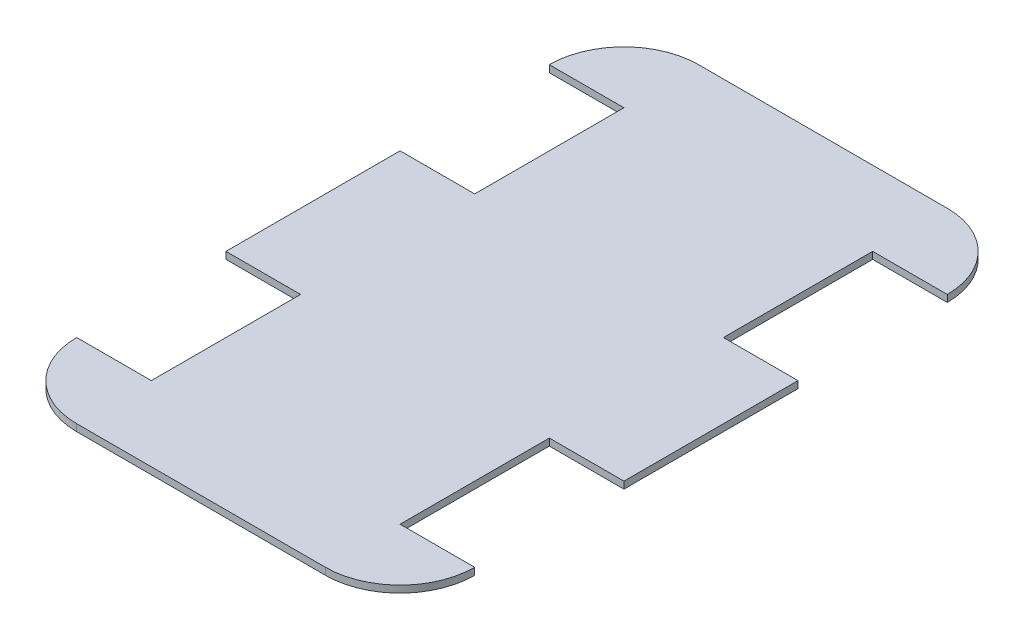
ISO-10303-21;
HEADER;
FILE_DESCRIPTION(('STEP AP214'),'2;1');
FILE_NAME('part.step','',(''),(''),'','','');
FILE_SCHEMA(('AUTOMOTIVE_DESIGN { 1 0 10303 214 1 1 1 1 }'));
ENDSEC;
DATA;
#1=APPLICATION_CONTEXT('core data for automotive mechanical design processes');
#2=APPLICATION_PROTOCOL_DEFINITION('international standard','automotive_design',2000,#1);
#3=PRODUCT_CONTEXT('',#1,'mechanical');
#4=PRODUCT('Part','Part','',(#3));
#5=PRODUCT_RELATED_PRODUCT_CATEGORY('part','',(#4));
#6=PRODUCT_DEFINITION_FORMATION('','',#4);
#7=PRODUCT_DEFINITION_CONTEXT('part definition',#1,'design');
#8=PRODUCT_DEFINITION('design','',#6,#7);
#9=PRODUCT_DEFINITION_SHAPE('','',#8);
#10=(LENGTH_UNIT() NAMED_UNIT(*) SI_UNIT(.MILLI.,.METRE.));
#11=(NAMED_UNIT(*) PLANE_ANGLE_UNIT() SI_UNIT($,.RADIAN.));
#12=(NAMED_UNIT(*) SI_UNIT($,.STERADIAN.) SOLID_ANGLE_UNIT());
#13=UNCERTAINTY_MEASURE_WITH_UNIT(LENGTH_MEASURE(1.E-05),#10,'distance_accuracy_value','');
#14=(GEOMETRIC_REPRESENTATION_CONTEXT(3) GLOBAL_UNCERTAINTY_ASSIGNED_CONTEXT((#13)) GLOBAL_UNIT_ASSIGNED_CONTEXT((#10,
#11,#12)) REPRESENTATION_CONTEXT('',''));
#15=CARTESIAN_POINT('',(0.,0.,0.));
#16=DIRECTION('',(0.,0.,1.));
#17=DIRECTION('',(1.,0.,0.));
#18=AXIS2_PLACEMENT_3D('',#15,#16,#17);
#19=CARTESIAN_POINT('',(130.,2.8,-220.));
#20=DIRECTION('',(-1.,0.,0.));
#21=DIRECTION('',(0.,0.,1.));
#22=AXIS2_PLACEMENT_3D('',#19,#20,#21);
#23=PLANE('',#22);
#24=DIRECTION('',(0.,0.,-1.));
#25=VECTOR('',#24,1.);
#26=CARTESIAN_POINT('',(130.,0.,-220.));
#27=LINE('',#26,#25);
#28=CARTESIAN_POINT('',(130.,0.,-160.));
#29=VERTEX_POINT('',#28);
#30=CARTESIAN_POINT('',(130.,0.,-220.));
#31=VERTEX_POINT('',#30);
#32=EDGE_CURVE('E201',#29,#31,#27,.T.);
#33=ORIENTED_EDGE('',*,*,#32,.T.);
#34=DIRECTION('',(0.,-1.,0.));
#35=VECTOR('',#34,1.);
#36=CARTESIAN_POINT('',(130.,2.8,-220.));
#37=LINE('',#36,#35);
#38=CARTESIAN_POINT('',(130.,2.8,-220.));
#39=VERTEX_POINT('',#38);
#40=EDGE_CURVE('E11',#39,#31,#37,.T.);
#41=ORIENTED_EDGE('',*,*,#40,.F.);
#42=DIRECTION('',(0.,0.,-1.));
#43=VECTOR('',#42,1.);
#44=CARTESIAN_POINT('',(130.,2.8,-220.));
#45=LINE('',#44,#43);
#46=CARTESIAN_POINT('',(130.,2.8,-160.));
#47=VERTEX_POINT('',#46);
#48=EDGE_CURVE('E239',#47,#39,#45,.T.);
#49=ORIENTED_EDGE('',*,*,#48,.F.);
#50=DIRECTION('',(0.,-1.,0.));
#51=VECTOR('',#50,1.);
#52=CARTESIAN_POINT('',(130.,2.8,-160.));
#53=LINE('',#52,#51);
#54=EDGE_CURVE('E197',#47,#29,#53,.T.);
#55=ORIENTED_EDGE('',*,*,#54,.T.);
#56=EDGE_LOOP('',(#33,#41,#49,#55));
#57=FACE_BOUND('',#56,.T.);
#58=ADVANCED_FACE('F33',(#57),#23,.F.);
#59=CARTESIAN_POINT('',(160.,2.8,-220.));
#60=DIRECTION('',(0.,0.,-1.));
#61=DIRECTION('',(-1.,0.,0.));
#62=AXIS2_PLACEMENT_3D('',#59,#60,#61);
#63=PLANE('',#62);
#64=DIRECTION('',(1.,0.,0.));
#65=VECTOR('',#64,1.);
#66=CARTESIAN_POINT('',(160.,0.,-220.));
#67=LINE('',#66,#65);
#68=CARTESIAN_POINT('',(160.,0.,-220.));
#69=VERTEX_POINT('',#68);
#70=EDGE_CURVE('E204',#31,#69,#67,.T.);
#71=ORIENTED_EDGE('',*,*,#70,.T.);
#72=DIRECTION('',(0.,-1.,0.));
#73=VECTOR('',#72,1.);
#74=CARTESIAN_POINT('',(160.,2.8,-220.));
#75=LINE('',#74,#73);
#76=CARTESIAN_POINT('',(160.,2.8,-220.));
#77=VERTEX_POINT('',#76);
#78=EDGE_CURVE('E41',#77,#69,#75,.T.);
#79=ORIENTED_EDGE('',*,*,#78,.F.);
#80=DIRECTION('',(1.,0.,0.));
#81=VECTOR('',#80,1.);
#82=CARTESIAN_POINT('',(160.,2.8,-220.));
#83=LINE('',#82,#81);
#84=EDGE_CURVE('E128',#39,#77,#83,.T.);
#85=ORIENTED_EDGE('',*,*,#84,.F.);
#86=ORIENTED_EDGE('',*,*,#40,.T.);
#87=EDGE_LOOP('',(#71,#79,#85,#86));
#88=FACE_BOUND('',#87,.T.);
#89=ADVANCED_FACE('F357',(#88),#63,.F.);
#90=CARTESIAN_POINT('',(130.,2.8,-220.));
#91=DIRECTION('',(0.,-1.,0.));
#92=DIRECTION('',(0.,0.,-1.));
#93=AXIS2_PLACEMENT_3D('',#90,#91,#92);
#94=CYLINDRICAL_SURFACE('',#93,30.);
#95=CARTESIAN_POINT('',(130.,0.,-220.));
#96=DIRECTION('',(0.,1.,0.));
#97=DIRECTION('',(0.,0.,1.));
#98=AXIS2_PLACEMENT_3D('',#95,#96,#97);
#99=CIRCLE('',#98,30.);
#100=CARTESIAN_POINT('',(130.,0.,-250.));
#101=VERTEX_POINT('',#100);
#102=EDGE_CURVE('E206',#69,#101,#99,.T.);
#103=ORIENTED_EDGE('',*,*,#102,.T.);
#104=DIRECTION('',(0.,-1.,0.));
#105=VECTOR('',#104,1.);
#106=CARTESIAN_POINT('',(130.,2.8,-250.));
#107=LINE('',#106,#105);
#108=CARTESIAN_POINT('',(130.,2.8,-250.));
#109=VERTEX_POINT('',#108);
#110=EDGE_CURVE('E282',#109,#101,#107,.T.);
#111=ORIENTED_EDGE('',*,*,#110,.F.);
#112=CARTESIAN_POINT('',(130.,2.8,-220.));
#113=DIRECTION('',(0.,1.,0.));
#114=DIRECTION('',(0.,0.,1.));
#115=AXIS2_PLACEMENT_3D('',#112,#113,#114);
#116=CIRCLE('',#115,30.);
#117=EDGE_CURVE('E290',#77,#109,#116,.T.);
#118=ORIENTED_EDGE('',*,*,#117,.F.);
#119=ORIENTED_EDGE('',*,*,#78,.T.);
#120=EDGE_LOOP('',(#103,#111,#118,#119));
#121=FACE_BOUND('',#120,.T.);
#122=ADVANCED_FACE('F288',(#121),#94,.T.);
#123=CARTESIAN_POINT('',(30.0000000000002,2.8,-250.));
#124=DIRECTION('',(0.,0.,1.));
#125=DIRECTION('',(1.,0.,0.));
#126=AXIS2_PLACEMENT_3D('',#123,#124,#125);
#127=PLANE('',#126);
#128=DIRECTION('',(-1.,0.,0.));
#129=VECTOR('',#128,1.);
#130=CARTESIAN_POINT('',(30.0000000000002,0.,-250.));
#131=LINE('',#130,#129);
#132=CARTESIAN_POINT('',(30.0000000000002,0.,-250.));
#133=VERTEX_POINT('',#132);
#134=EDGE_CURVE('E208',#101,#133,#131,.T.);
#135=ORIENTED_EDGE('',*,*,#134,.T.);
#136=DIRECTION('',(0.,-1.,0.));
#137=VECTOR('',#136,1.);
#138=CARTESIAN_POINT('',(30.0000000000002,2.8,-250.));
#139=LINE('',#138,#137);
#140=CARTESIAN_POINT('',(30.0000000000002,2.8,-250.));
#141=VERTEX_POINT('',#140);
#142=EDGE_CURVE('E279',#141,#133,#139,.T.);
#143=ORIENTED_EDGE('',*,*,#142,.F.);
#144=DIRECTION('',(-1.,0.,0.));
#145=VECTOR('',#144,1.);
#146=CARTESIAN_POINT('',(30.0000000000002,2.8,-250.));
#147=LINE('',#146,#145);
#148=EDGE_CURVE('E308',#109,#141,#147,.T.);
#149=ORIENTED_EDGE('',*,*,#148,.F.);
#150=ORIENTED_EDGE('',*,*,#110,.T.);
#151=EDGE_LOOP('',(#135,#143,#149,#150));
#152=FACE_BOUND('',#151,.T.);
#153=ADVANCED_FACE('F299',(#152),#127,.F.);
#154=CARTESIAN_POINT('',(29.9999999999999,2.8,-220.));
#155=DIRECTION('',(0.,-1.,0.));
#156=DIRECTION('',(0.,0.,-1.));
#157=AXIS2_PLACEMENT_3D('',#154,#155,#156);
#158=CYLINDRICAL_SURFACE('',#157,30.);
#159=CARTESIAN_POINT('',(29.9999999999999,0.,-220.));
#160=DIRECTION('',(0.,1.,0.));
#161=DIRECTION('',(0.,0.,-1.));
#162=AXIS2_PLACEMENT_3D('',#159,#160,#161);
#163=CIRCLE('',#162,30.);
#164=CARTESIAN_POINT('',(0.,0.,-220.));
#165=VERTEX_POINT('',#164);
#166=EDGE_CURVE('E210',#133,#165,#163,.T.);
#167=ORIENTED_EDGE('',*,*,#166,.T.);
#168=DIRECTION('',(0.,-1.,0.));
#169=VECTOR('',#168,1.);
#170=CARTESIAN_POINT('',(0.,2.8,-220.));
#171=LINE('',#170,#169);
#172=CARTESIAN_POINT('',(0.,2.8,-220.));
#173=VERTEX_POINT('',#172);
#174=EDGE_CURVE('E276',#173,#165,#171,.T.);
#175=ORIENTED_EDGE('',*,*,#174,.F.);
#176=CARTESIAN_POINT('',(29.9999999999999,2.8,-220.));
#177=DIRECTION('',(0.,1.,0.));
#178=DIRECTION('',(0.,0.,-1.));
#179=AXIS2_PLACEMENT_3D('',#176,#177,#178);
#180=CIRCLE('',#179,30.);
#181=EDGE_CURVE('E305',#141,#173,#180,.T.);
#182=ORIENTED_EDGE('',*,*,#181,.F.);
#183=ORIENTED_EDGE('',*,*,#142,.T.);
#184=EDGE_LOOP('',(#167,#175,#182,#183));
#185=FACE_BOUND('',#184,.T.);
#186=ADVANCED_FACE('F303',(#185),#158,.T.);
#187=CARTESIAN_POINT('',(0.,2.8,-220.));
#188=DIRECTION('',(0.,0.,-1.));
#189=DIRECTION('',(-1.,0.,0.));
#190=AXIS2_PLACEMENT_3D('',#187,#188,#189);
#191=PLANE('',#190);
#192=DIRECTION('',(1.,0.,0.));
#193=VECTOR('',#192,1.);
#194=CARTESIAN_POINT('',(0.,0.,-220.));
#195=LINE('',#194,#193);
#196=CARTESIAN_POINT('',(30.,0.,-220.));
#197=VERTEX_POINT('',#196);
#198=EDGE_CURVE('E212',#165,#197,#195,.T.);
#199=ORIENTED_EDGE('',*,*,#198,.T.);
#200=DIRECTION('',(0.,-1.,0.));
#201=VECTOR('',#200,1.);
#202=CARTESIAN_POINT('',(30.,2.8,-220.));
#203=LINE('',#202,#201);
#204=CARTESIAN_POINT('',(30.,2.8,-220.));
#205=VERTEX_POINT('',#204);
#206=EDGE_CURVE('E273',#205,#197,#203,.T.);
#207=ORIENTED_EDGE('',*,*,#206,.F.);
#208=DIRECTION('',(1.,0.,0.));
#209=VECTOR('',#208,1.);
#210=CARTESIAN_POINT('',(0.,2.8,-220.));
#211=LINE('',#210,#209);
#212=EDGE_CURVE('E307',#173,#205,#211,.T.);
#213=ORIENTED_EDGE('',*,*,#212,.F.);
#214=ORIENTED_EDGE('',*,*,#174,.T.);
#215=EDGE_LOOP('',(#199,#207,#213,#214));
#216=FACE_BOUND('',#215,.T.);
#217=ADVANCED_FACE('F370',(#216),#191,.F.);
#218=CARTESIAN_POINT('',(30.,2.8,-220.));
#219=DIRECTION('',(1.,0.,0.));
#220=DIRECTION('',(0.,0.,-1.));
#221=AXIS2_PLACEMENT_3D('',#218,#219,#220);
#222=PLANE('',#221);
#223=DIRECTION('',(0.,0.,1.));
#224=VECTOR('',#223,1.);
#225=CARTESIAN_POINT('',(30.,0.,-220.));
#226=LINE('',#225,#224);
#227=CARTESIAN_POINT('',(30.,0.,-160.));
#228=VERTEX_POINT('',#227);
#229=EDGE_CURVE('E214',#197,#228,#226,.T.);
#230=ORIENTED_EDGE('',*,*,#229,.T.);
#231=DIRECTION('',(0.,-1.,0.));
#232=VECTOR('',#231,1.);
#233=CARTESIAN_POINT('',(30.,2.8,-160.));
#234=LINE('',#233,#232);
#235=CARTESIAN_POINT('',(30.,2.8,-160.));
#236=VERTEX_POINT('',#235);
#237=EDGE_CURVE('E270',#236,#228,#234,.T.);
#238=ORIENTED_EDGE('',*,*,#237,.F.);
#239=DIRECTION('',(0.,0.,1.));
#240=VECTOR('',#239,1.);
#241=CARTESIAN_POINT('',(30.,2.8,-220.));
#242=LINE('',#241,#240);
#243=EDGE_CURVE('E310',#205,#236,#242,.T.);
#244=ORIENTED_EDGE('',*,*,#243,.F.);
#245=ORIENTED_EDGE('',*,*,#206,.T.);
#246=EDGE_LOOP('',(#230,#238,#244,#245));
#247=FACE_BOUND('',#246,.T.);
#248=ADVANCED_FACE('F373',(#247),#222,.F.);
#249=CARTESIAN_POINT('',(30.,2.8,-160.));
#250=DIRECTION('',(0.,0.,1.));
#251=DIRECTION('',(1.,0.,0.));
#252=AXIS2_PLACEMENT_3D('',#249,#250,#251);
#253=PLANE('',#252);
#254=DIRECTION('',(-1.,0.,0.));
#255=VECTOR('',#254,1.);
#256=CARTESIAN_POINT('',(30.,0.,-160.));
#257=LINE('',#256,#255);
#258=CARTESIAN_POINT('',(0.,0.,-160.));
#259=VERTEX_POINT('',#258);
#260=EDGE_CURVE('E216',#228,#259,#257,.T.);
#261=ORIENTED_EDGE('',*,*,#260,.T.);
#262=DIRECTION('',(0.,-1.,0.));
#263=VECTOR('',#262,1.);
#264=CARTESIAN_POINT('',(0.,2.8,-160.));
#265=LINE('',#264,#263);
#266=CARTESIAN_POINT('',(0.,2.8,-160.));
#267=VERTEX_POINT('',#266);
#268=EDGE_CURVE('E267',#267,#259,#265,.T.);
#269=ORIENTED_EDGE('',*,*,#268,.F.);
#270=DIRECTION('',(-1.,0.,0.));
#271=VECTOR('',#270,1.);
#272=CARTESIAN_POINT('',(30.,2.8,-160.));
#273=LINE('',#272,#271);
#274=EDGE_CURVE('E316',#236,#267,#273,.T.);
#275=ORIENTED_EDGE('',*,*,#274,.F.);
#276=ORIENTED_EDGE('',*,*,#237,.T.);
#277=EDGE_LOOP('',(#261,#269,#275,#276));
#278=FACE_BOUND('',#277,.T.);
#279=ADVANCED_FACE('F377',(#278),#253,.F.);
#280=CARTESIAN_POINT('',(0.,2.8,-90.0000000000002));
#281=DIRECTION('',(1.,0.,0.));
#282=DIRECTION('',(0.,0.,-1.));
#283=AXIS2_PLACEMENT_3D('',#280,#281,#282);
#284=PLANE('',#283);
#285=DIRECTION('',(0.,0.,1.));
#286=VECTOR('',#285,1.);
#287=CARTESIAN_POINT('',(0.,0.,-90.0000000000002));
#288=LINE('',#287,#286);
#289=CARTESIAN_POINT('',(0.,0.,-90.0000000000002));
#290=VERTEX_POINT('',#289);
#291=EDGE_CURVE('E218',#259,#290,#288,.T.);
#292=ORIENTED_EDGE('',*,*,#291,.T.);
#293=DIRECTION('',(0.,-1.,0.));
#294=VECTOR('',#293,1.);
#295=CARTESIAN_POINT('',(0.,2.8,-90.0000000000002));
#296=LINE('',#295,#294);
#297=CARTESIAN_POINT('',(0.,2.8,-90.0000000000002));
#298=VERTEX_POINT('',#297);
#299=EDGE_CURVE('E264',#298,#290,#296,.T.);
#300=ORIENTED_EDGE('',*,*,#299,.F.);
#301=DIRECTION('',(0.,0.,1.));
#302=VECTOR('',#301,1.);
#303=CARTESIAN_POINT('',(0.,2.8,-90.0000000000002));
#304=LINE('',#303,#302);
#305=EDGE_CURVE('E318',#267,#298,#304,.T.);
#306=ORIENTED_EDGE('',*,*,#305,.F.);
#307=ORIENTED_EDGE('',*,*,#268,.T.);
#308=EDGE_LOOP('',(#292,#300,#306,#307));
#309=FACE_BOUND('',#308,.T.);
#310=ADVANCED_FACE('F381',(#309),#284,.F.);
#311=CARTESIAN_POINT('',(30.,2.8,-90.0000000000002));
#312=DIRECTION('',(0.,0.,-1.));
#313=DIRECTION('',(-1.,0.,0.));
#314=AXIS2_PLACEMENT_3D('',#311,#312,#313);
#315=PLANE('',#314);
#316=DIRECTION('',(1.,0.,0.));
#317=VECTOR('',#316,1.);
#318=CARTESIAN_POINT('',(30.,0.,-90.0000000000002));
#319=LINE('',#318,#317);
#320=CARTESIAN_POINT('',(30.,0.,-90.0000000000002));
#321=VERTEX_POINT('',#320);
#322=EDGE_CURVE('E220',#290,#321,#319,.T.);
#323=ORIENTED_EDGE('',*,*,#322,.T.);
#324=DIRECTION('',(0.,-1.,0.));
#325=VECTOR('',#324,1.);
#326=CARTESIAN_POINT('',(30.,2.8,-90.0000000000002));
#327=LINE('',#326,#325);
#328=CARTESIAN_POINT('',(30.,2.8,-90.0000000000002));
#329=VERTEX_POINT('',#328);
#330=EDGE_CURVE('E261',#329,#321,#327,.T.);
#331=ORIENTED_EDGE('',*,*,#330,.F.);
#332=DIRECTION('',(1.,0.,0.));
#333=VECTOR('',#332,1.);
#334=CARTESIAN_POINT('',(30.,2.8,-90.0000000000002));
#335=LINE('',#334,#333);
#336=EDGE_CURVE('E320',#298,#329,#335,.T.);
#337=ORIENTED_EDGE('',*,*,#336,.F.);
#338=ORIENTED_EDGE('',*,*,#299,.T.);
#339=EDGE_LOOP('',(#323,#331,#337,#338));
#340=FACE_BOUND('',#339,.T.);
#341=ADVANCED_FACE('F385',(#340),#315,.F.);
#342=CARTESIAN_POINT('',(30.,2.8,-30.0000000000002));
#343=DIRECTION('',(1.,0.,0.));
#344=DIRECTION('',(0.,0.,-1.));
#345=AXIS2_PLACEMENT_3D('',#342,#343,#344);
#346=PLANE('',#345);
#347=DIRECTION('',(0.,0.,1.));
#348=VECTOR('',#347,1.);
#349=CARTESIAN_POINT('',(30.,0.,-30.0000000000002));
#350=LINE('',#349,#348);
#351=CARTESIAN_POINT('',(30.,0.,-30.0000000000002));
#352=VERTEX_POINT('',#351);
#353=EDGE_CURVE('E222',#321,#352,#350,.T.);
#354=ORIENTED_EDGE('',*,*,#353,.T.);
#355=DIRECTION('',(0.,-1.,0.));
#356=VECTOR('',#355,1.);
#357=CARTESIAN_POINT('',(30.,2.8,-30.0000000000002));
#358=LINE('',#357,#356);
#359=CARTESIAN_POINT('',(30.,2.8,-30.0000000000002));
#360=VERTEX_POINT('',#359);
#361=EDGE_CURVE('E258',#360,#352,#358,.T.);
#362=ORIENTED_EDGE('',*,*,#361,.F.);
#363=DIRECTION('',(0.,0.,1.));
#364=VECTOR('',#363,1.);
#365=CARTESIAN_POINT('',(30.,2.8,-30.0000000000002));
#366=LINE('',#365,#364);
#367=EDGE_CURVE('E322',#329,#360,#366,.T.);
#368=ORIENTED_EDGE('',*,*,#367,.F.);
#369=ORIENTED_EDGE('',*,*,#330,.T.);
#370=EDGE_LOOP('',(#354,#362,#368,#369));
#371=FACE_BOUND('',#370,.T.);
#372=ADVANCED_FACE('F389',(#371),#346,.F.);
#373=CARTESIAN_POINT('',(0.,2.8,-30.0000000000002));
#374=DIRECTION('',(0.,0.,1.));
#375=DIRECTION('',(1.,0.,0.));
#376=AXIS2_PLACEMENT_3D('',#373,#374,#375);
#377=PLANE('',#376);
#378=DIRECTION('',(-1.,0.,0.));
#379=VECTOR('',#378,1.);
#380=CARTESIAN_POINT('',(0.,0.,-30.0000000000002));
#381=LINE('',#380,#379);
#382=CARTESIAN_POINT('',(0.,0.,-30.0000000000002));
#383=VERTEX_POINT('',#382);
#384=EDGE_CURVE('E224',#352,#383,#381,.T.);
#385=ORIENTED_EDGE('',*,*,#384,.T.);
#386=DIRECTION('',(0.,-1.,0.));
#387=VECTOR('',#386,1.);
#388=CARTESIAN_POINT('',(0.,2.8,-30.0000000000002));
#389=LINE('',#388,#387);
#390=CARTESIAN_POINT('',(0.,2.8,-30.0000000000002));
#391=VERTEX_POINT('',#390);
#392=EDGE_CURVE('E255',#391,#383,#389,.T.);
#393=ORIENTED_EDGE('',*,*,#392,.F.);
#394=DIRECTION('',(-1.,0.,0.));
#395=VECTOR('',#394,1.);
#396=CARTESIAN_POINT('',(0.,2.8,-30.0000000000002));
#397=LINE('',#396,#395);
#398=EDGE_CURVE('E324',#360,#391,#397,.T.);
#399=ORIENTED_EDGE('',*,*,#398,.F.);
#400=ORIENTED_EDGE('',*,*,#361,.T.);
#401=EDGE_LOOP('',(#385,#393,#399,#400));
#402=FACE_BOUND('',#401,.T.);
#403=ADVANCED_FACE('F393',(#402),#377,.F.);
#404=CARTESIAN_POINT('',(30.,2.8,-30.));
#405=DIRECTION('',(0.,-1.,0.));
#406=DIRECTION('',(0.,0.,-1.));
#407=AXIS2_PLACEMENT_3D('',#404,#405,#406);
#408=CYLINDRICAL_SURFACE('',#407,30.);
#409=CARTESIAN_POINT('',(30.,0.,-30.));
#410=DIRECTION('',(0.,1.,0.));
#411=DIRECTION('',(0.,0.,1.));
#412=AXIS2_PLACEMENT_3D('',#409,#410,#411);
#413=CIRCLE('',#412,30.);
#414=CARTESIAN_POINT('',(30.,0.,0.));
#415=VERTEX_POINT('',#414);
#416=EDGE_CURVE('E226',#383,#415,#413,.T.);
#417=ORIENTED_EDGE('',*,*,#416,.T.);
#418=DIRECTION('',(0.,-1.,0.));
#419=VECTOR('',#418,1.);
#420=CARTESIAN_POINT('',(30.,2.8,0.));
#421=LINE('',#420,#419);
#422=CARTESIAN_POINT('',(30.,2.8,0.));
#423=VERTEX_POINT('',#422);
#424=EDGE_CURVE('E252',#423,#415,#421,.T.);
#425=ORIENTED_EDGE('',*,*,#424,.F.);
#426=CARTESIAN_POINT('',(30.,2.8,-30.));
#427=DIRECTION('',(0.,1.,0.));
#428=DIRECTION('',(0.,0.,1.));
#429=AXIS2_PLACEMENT_3D('',#426,#427,#428);
#430=CIRCLE('',#429,30.);
#431=EDGE_CURVE('E326',#391,#423,#430,.T.);
#432=ORIENTED_EDGE('',*,*,#431,.F.);
#433=ORIENTED_EDGE('',*,*,#392,.T.);
#434=EDGE_LOOP('',(#417,#425,#432,#433));
#435=FACE_BOUND('',#434,.T.);
#436=ADVANCED_FACE('F397',(#435),#408,.T.);
#437=CARTESIAN_POINT('',(30.0000000000002,2.8,0.));
#438=DIRECTION('',(0.,0.,-1.));
#439=DIRECTION('',(-1.,0.,0.));
#440=AXIS2_PLACEMENT_3D('',#437,#438,#439);
#441=PLANE('',#440);
#442=DIRECTION('',(1.,0.,0.));
#443=VECTOR('',#442,1.);
#444=CARTESIAN_POINT('',(30.0000000000002,0.,0.));
#445=LINE('',#444,#443);
#446=CARTESIAN_POINT('',(130.,0.,0.));
#447=VERTEX_POINT('',#446);
#448=EDGE_CURVE('E228',#415,#447,#445,.T.);
#449=ORIENTED_EDGE('',*,*,#448,.T.);
#450=DIRECTION('',(0.,-1.,0.));
#451=VECTOR('',#450,1.);
#452=CARTESIAN_POINT('',(130.,2.8,0.));
#453=LINE('',#452,#451);
#454=CARTESIAN_POINT('',(130.,2.8,0.));
#455=VERTEX_POINT('',#454);
#456=EDGE_CURVE('E249',#455,#447,#453,.T.);
#457=ORIENTED_EDGE('',*,*,#456,.F.);
#458=DIRECTION('',(1.,0.,0.));
#459=VECTOR('',#458,1.);
#460=CARTESIAN_POINT('',(30.0000000000002,2.8,0.));
#461=LINE('',#460,#459);
#462=EDGE_CURVE('E328',#423,#455,#461,.T.);
#463=ORIENTED_EDGE('',*,*,#462,.F.);
#464=ORIENTED_EDGE('',*,*,#424,.T.);
#465=EDGE_LOOP('',(#449,#457,#463,#464));
#466=FACE_BOUND('',#465,.T.);
#467=ADVANCED_FACE('F401',(#466),#441,.F.);
#468=CARTESIAN_POINT('',(130.,2.8,-30.));
#469=DIRECTION('',(0.,-1.,0.));
#470=DIRECTION('',(0.,0.,-1.));
#471=AXIS2_PLACEMENT_3D('',#468,#469,#470);
#472=CYLINDRICAL_SURFACE('',#471,30.);
#473=CARTESIAN_POINT('',(130.,0.,-30.));
#474=DIRECTION('',(0.,1.,0.));
#475=DIRECTION('',(0.,0.,-1.));
#476=AXIS2_PLACEMENT_3D('',#473,#474,#475);
#477=CIRCLE('',#476,30.);
#478=CARTESIAN_POINT('',(160.,0.,-30.0000000000002));
#479=VERTEX_POINT('',#478);
#480=EDGE_CURVE('E230',#447,#479,#477,.T.);
#481=ORIENTED_EDGE('',*,*,#480,.T.);
#482=DIRECTION('',(0.,-1.,0.));
#483=VECTOR('',#482,1.);
#484=CARTESIAN_POINT('',(160.,2.8,-30.0000000000002));
#485=LINE('',#484,#483);
#486=CARTESIAN_POINT('',(160.,2.8,-30.0000000000002));
#487=VERTEX_POINT('',#486);
#488=EDGE_CURVE('E246',#487,#479,#485,.T.);
#489=ORIENTED_EDGE('',*,*,#488,.F.);
#490=CARTESIAN_POINT('',(130.,2.8,-30.));
#491=DIRECTION('',(0.,1.,0.));
#492=DIRECTION('',(0.,0.,-1.));
#493=AXIS2_PLACEMENT_3D('',#490,#491,#492);
#494=CIRCLE('',#493,30.);
#495=EDGE_CURVE('E330',#455,#487,#494,.T.);
#496=ORIENTED_EDGE('',*,*,#495,.F.);
#497=ORIENTED_EDGE('',*,*,#456,.T.);
#498=EDGE_LOOP('',(#481,#489,#496,#497));
#499=FACE_BOUND('',#498,.T.);
#500=ADVANCED_FACE('F405',(#499),#472,.T.);
#501=CARTESIAN_POINT('',(130.,2.8,-30.));
#502=DIRECTION('',(0.,0.,1.));
#503=DIRECTION('',(1.,0.,0.));
#504=AXIS2_PLACEMENT_3D('',#501,#502,#503);
#505=PLANE('',#504);
#506=DIRECTION('',(-1.,0.,0.));
#507=VECTOR('',#506,1.);
#508=CARTESIAN_POINT('',(130.,0.,-30.));
#509=LINE('',#508,#507);
#510=CARTESIAN_POINT('',(130.,0.,-30.));
#511=VERTEX_POINT('',#510);
#512=EDGE_CURVE('E232',#479,#511,#509,.T.);
#513=ORIENTED_EDGE('',*,*,#512,.T.);
#514=DIRECTION('',(0.,-1.,0.));
#515=VECTOR('',#514,1.);
#516=CARTESIAN_POINT('',(130.,2.8,-30.));
#517=LINE('',#516,#515);
#518=CARTESIAN_POINT('',(130.,2.8,-30.));
#519=VERTEX_POINT('',#518);
#520=EDGE_CURVE('E243',#519,#511,#517,.T.);
#521=ORIENTED_EDGE('',*,*,#520,.F.);
#522=DIRECTION('',(-1.,0.,0.));
#523=VECTOR('',#522,1.);
#524=CARTESIAN_POINT('',(130.,2.8,-30.));
#525=LINE('',#524,#523);
#526=EDGE_CURVE('E332',#487,#519,#525,.T.);
#527=ORIENTED_EDGE('',*,*,#526,.F.);
#528=ORIENTED_EDGE('',*,*,#488,.T.);
#529=EDGE_LOOP('',(#513,#521,#527,#528));
#530=FACE_BOUND('',#529,.T.);
#531=ADVANCED_FACE('F338',(#530),#505,.F.);
#532=CARTESIAN_POINT('',(130.,2.8,-90.0000000000002));
#533=DIRECTION('',(-1.,0.,0.));
#534=DIRECTION('',(0.,0.,1.));
#535=AXIS2_PLACEMENT_3D('',#532,#533,#534);
#536=PLANE('',#535);
#537=DIRECTION('',(0.,0.,-1.));
#538=VECTOR('',#537,1.);
#539=CARTESIAN_POINT('',(130.,0.,-90.0000000000002));
#540=LINE('',#539,#538);
#541=CARTESIAN_POINT('',(130.,0.,-90.0000000000002));
#542=VERTEX_POINT('',#541);
#543=EDGE_CURVE('E234',#511,#542,#540,.T.);
#544=ORIENTED_EDGE('',*,*,#543,.T.);
#545=DIRECTION('',(0.,-1.,0.));
#546=VECTOR('',#545,1.);
#547=CARTESIAN_POINT('',(130.,2.8,-90.0000000000002));
#548=LINE('',#547,#546);
#549=CARTESIAN_POINT('',(130.,2.8,-90.0000000000002));
#550=VERTEX_POINT('',#549);
#551=EDGE_CURVE('E192',#550,#542,#548,.T.);
#552=ORIENTED_EDGE('',*,*,#551,.F.);
#553=DIRECTION('',(0.,0.,-1.));
#554=VECTOR('',#553,1.);
#555=CARTESIAN_POINT('',(130.,2.8,-90.0000000000002));
#556=LINE('',#555,#554);
#557=EDGE_CURVE('E183',#519,#550,#556,.T.);
#558=ORIENTED_EDGE('',*,*,#557,.F.);
#559=ORIENTED_EDGE('',*,*,#520,.T.);
#560=EDGE_LOOP('',(#544,#552,#558,#559));
#561=FACE_BOUND('',#560,.T.);
#562=ADVANCED_FACE('F342',(#561),#536,.F.);
#563=CARTESIAN_POINT('',(160.,2.8,-90.0000000000002));
#564=DIRECTION('',(0.,0.,-1.));
#565=DIRECTION('',(-1.,0.,0.));
#566=AXIS2_PLACEMENT_3D('',#563,#564,#565);
#567=PLANE('',#566);
#568=DIRECTION('',(1.,0.,0.));
#569=VECTOR('',#568,1.);
#570=CARTESIAN_POINT('',(160.,0.,-90.0000000000002));
#571=LINE('',#570,#569);
#572=CARTESIAN_POINT('',(160.,0.,-90.0000000000002));
#573=VERTEX_POINT('',#572);
#574=EDGE_CURVE('E191',#542,#573,#571,.T.);
#575=ORIENTED_EDGE('',*,*,#574,.T.);
#576=DIRECTION('',(0.,-1.,0.));
#577=VECTOR('',#576,1.);
#578=CARTESIAN_POINT('',(160.,2.8,-90.0000000000002));
#579=LINE('',#578,#577);
#580=CARTESIAN_POINT('',(160.,2.8,-90.0000000000002));
#581=VERTEX_POINT('',#580);
#582=EDGE_CURVE('E188',#581,#573,#579,.T.);
#583=ORIENTED_EDGE('',*,*,#582,.F.);
#584=DIRECTION('',(1.,0.,0.));
#585=VECTOR('',#584,1.);
#586=CARTESIAN_POINT('',(160.,2.8,-90.0000000000002));
#587=LINE('',#586,#585);
#588=EDGE_CURVE('E177',#550,#581,#587,.T.);
#589=ORIENTED_EDGE('',*,*,#588,.F.);
#590=ORIENTED_EDGE('',*,*,#551,.T.);
#591=EDGE_LOOP('',(#575,#583,#589,#590));
#592=FACE_BOUND('',#591,.T.);
#593=ADVANCED_FACE('F189',(#592),#567,.F.);
#594=CARTESIAN_POINT('',(160.,2.8,-90.0000000000002));
#595=DIRECTION('',(-1.,0.,0.));
#596=DIRECTION('',(0.,0.,1.));
#597=AXIS2_PLACEMENT_3D('',#594,#595,#596);
#598=PLANE('',#597);
#599=DIRECTION('',(0.,0.,-1.));
#600=VECTOR('',#599,1.);
#601=CARTESIAN_POINT('',(160.,0.,-90.0000000000002));
#602=LINE('',#601,#600);
#603=CARTESIAN_POINT('',(160.,0.,-160.));
#604=VERTEX_POINT('',#603);
#605=EDGE_CURVE('E114',#573,#604,#602,.T.);
#606=ORIENTED_EDGE('',*,*,#605,.T.);
#607=DIRECTION('',(0.,-1.,0.));
#608=VECTOR('',#607,1.);
#609=CARTESIAN_POINT('',(160.,2.8,-160.));
#610=LINE('',#609,#608);
#611=CARTESIAN_POINT('',(160.,2.8,-160.));
#612=VERTEX_POINT('',#611);
#613=EDGE_CURVE('E193',#612,#604,#610,.T.);
#614=ORIENTED_EDGE('',*,*,#613,.F.);
#615=DIRECTION('',(0.,0.,-1.));
#616=VECTOR('',#615,1.);
#617=CARTESIAN_POINT('',(160.,2.8,-90.0000000000002));
#618=LINE('',#617,#616);
#619=EDGE_CURVE('E181',#581,#612,#618,.T.);
#620=ORIENTED_EDGE('',*,*,#619,.F.);
#621=ORIENTED_EDGE('',*,*,#582,.T.);
#622=EDGE_LOOP('',(#606,#614,#620,#621));
#623=FACE_BOUND('',#622,.T.);
#624=ADVANCED_FACE('F195',(#623),#598,.F.);
#625=CARTESIAN_POINT('',(130.,2.8,-160.));
#626=DIRECTION('',(0.,0.,1.));
#627=DIRECTION('',(1.,0.,0.));
#628=AXIS2_PLACEMENT_3D('',#625,#626,#627);
#629=PLANE('',#628);
#630=DIRECTION('',(-1.,0.,0.));
#631=VECTOR('',#630,1.);
#632=CARTESIAN_POINT('',(130.,0.,-160.));
#633=LINE('',#632,#631);
#634=EDGE_CURVE('E120',#604,#29,#633,.T.);
#635=ORIENTED_EDGE('',*,*,#634,.T.);
#636=ORIENTED_EDGE('',*,*,#54,.F.);
#637=DIRECTION('',(-1.,0.,0.));
#638=VECTOR('',#637,1.);
#639=CARTESIAN_POINT('',(130.,2.8,-160.));
#640=LINE('',#639,#638);
#641=EDGE_CURVE('E49',#612,#47,#640,.T.);
#642=ORIENTED_EDGE('',*,*,#641,.F.);
#643=ORIENTED_EDGE('',*,*,#613,.T.);
#644=EDGE_LOOP('',(#635,#636,#642,#643));
#645=FACE_BOUND('',#644,.T.);
#646=ADVANCED_FACE('F346',(#645),#629,.F.);
#647=CARTESIAN_POINT('',(130.,2.8,-30.));
#648=DIRECTION('',(0.,-1.,0.));
#649=DIRECTION('',(0.,0.,-1.));
#650=AXIS2_PLACEMENT_3D('',#647,#648,#649);
#651=PLANE('',#650);
#652=ORIENTED_EDGE('',*,*,#48,.T.);
#653=ORIENTED_EDGE('',*,*,#84,.T.);
#654=ORIENTED_EDGE('',*,*,#117,.T.);
#655=ORIENTED_EDGE('',*,*,#148,.T.);
#656=ORIENTED_EDGE('',*,*,#181,.T.);
#657=ORIENTED_EDGE('',*,*,#212,.T.);
#658=ORIENTED_EDGE('',*,*,#243,.T.);
#659=ORIENTED_EDGE('',*,*,#274,.T.);
#660=ORIENTED_EDGE('',*,*,#305,.T.);
#661=ORIENTED_EDGE('',*,*,#336,.T.);
#662=ORIENTED_EDGE('',*,*,#367,.T.);
#663=ORIENTED_EDGE('',*,*,#398,.T.);
#664=ORIENTED_EDGE('',*,*,#431,.T.);
#665=ORIENTED_EDGE('',*,*,#462,.T.);
#666=ORIENTED_EDGE('',*,*,#495,.T.);
#667=ORIENTED_EDGE('',*,*,#526,.T.);
#668=ORIENTED_EDGE('',*,*,#557,.T.);
#669=ORIENTED_EDGE('',*,*,#588,.T.);
#670=ORIENTED_EDGE('',*,*,#619,.T.);
#671=ORIENTED_EDGE('',*,*,#641,.T.);
#672=EDGE_LOOP('',(#652,#653,#654,#655,#656,#657,#658,#659,#660,#661,#662,#663,#664,#665,#666,
#667,#668,#669,#670,#671));
#673=FACE_BOUND('',#672,.T.);
#674=ADVANCED_FACE('F179',(#673),#651,.F.);
#675=CARTESIAN_POINT('',(130.,0.,-30.));
#676=DIRECTION('',(0.,-1.,0.));
#677=DIRECTION('',(0.,0.,-1.));
#678=AXIS2_PLACEMENT_3D('',#675,#676,#677);
#679=PLANE('',#678);
#680=ORIENTED_EDGE('',*,*,#32,.F.);
#681=ORIENTED_EDGE('',*,*,#634,.F.);
#682=ORIENTED_EDGE('',*,*,#605,.F.);
#683=ORIENTED_EDGE('',*,*,#574,.F.);
#684=ORIENTED_EDGE('',*,*,#543,.F.);
#685=ORIENTED_EDGE('',*,*,#512,.F.);
#686=ORIENTED_EDGE('',*,*,#480,.F.);
#687=ORIENTED_EDGE('',*,*,#448,.F.);
#688=ORIENTED_EDGE('',*,*,#416,.F.);
#689=ORIENTED_EDGE('',*,*,#384,.F.);
#690=ORIENTED_EDGE('',*,*,#353,.F.);
#691=ORIENTED_EDGE('',*,*,#322,.F.);
#692=ORIENTED_EDGE('',*,*,#291,.F.);
#693=ORIENTED_EDGE('',*,*,#260,.F.);
#694=ORIENTED_EDGE('',*,*,#229,.F.);
#695=ORIENTED_EDGE('',*,*,#198,.F.);
#696=ORIENTED_EDGE('',*,*,#166,.F.);
#697=ORIENTED_EDGE('',*,*,#134,.F.);
#698=ORIENTED_EDGE('',*,*,#102,.F.);
#699=ORIENTED_EDGE('',*,*,#70,.F.);
#700=EDGE_LOOP('',(#680,#681,#682,#683,#684,#685,#686,#687,#688,#689,#690,#691,#692,#693,#694,
#695,#696,#697,#698,#699));
#701=FACE_BOUND('',#700,.T.);
#702=ADVANCED_FACE('F294',(#701),#679,.T.);
#703=CLOSED_SHELL('',(#58,#89,#122,#153,#186,#217,#248,#279,#310,#341,#372,#403,#436,#467,#500,
#531,#562,#593,#624,#646,#674,#702));
#704=MANIFOLD_SOLID_BREP('B2',#703);
#705=ADVANCED_BREP_SHAPE_REPRESENTATION('',(#18,#704),#14);
#706=SHAPE_DEFINITION_REPRESENTATION(#9,#705);
ENDSEC;
END-ISO-10303-21;
